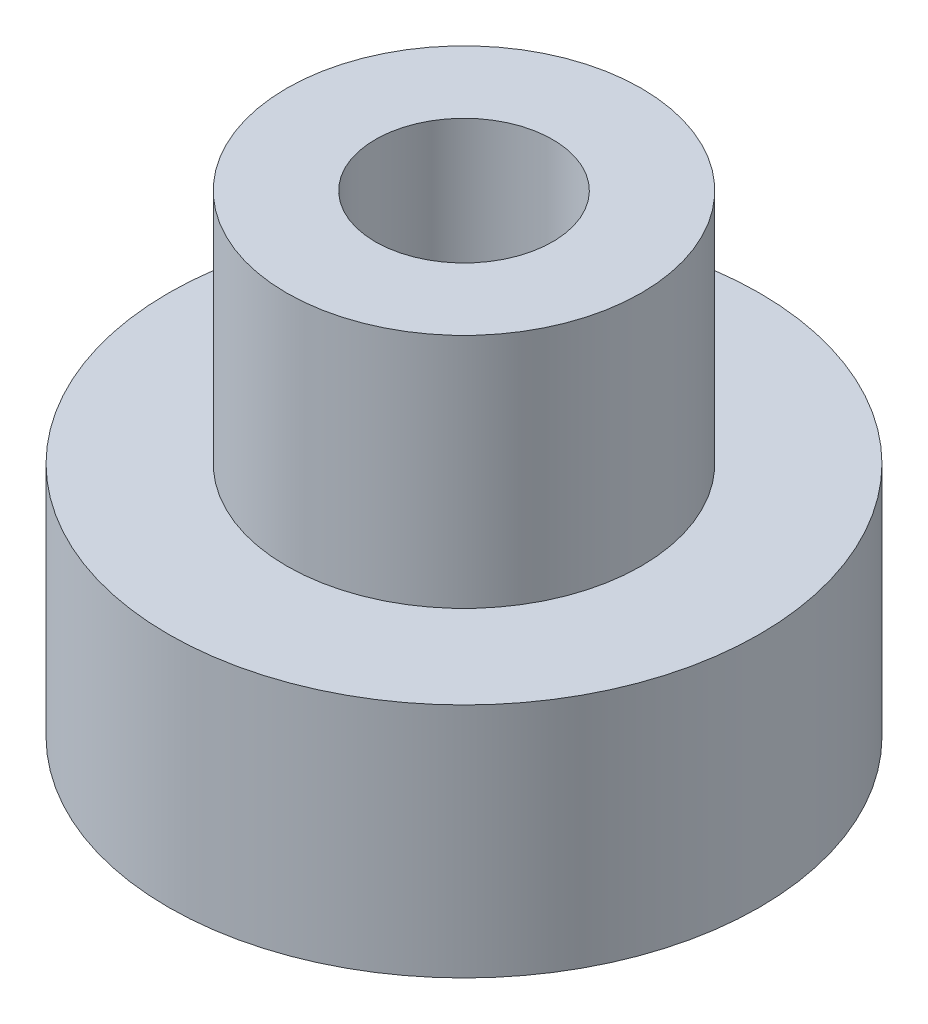
ISO-10303-21;
HEADER;
FILE_DESCRIPTION(('STEP AP214'),'2;1');
FILE_NAME('part.step','',(''),(''),'','','');
FILE_SCHEMA(('AUTOMOTIVE_DESIGN { 1 0 10303 214 1 1 1 1 }'));
ENDSEC;
DATA;
#1=APPLICATION_CONTEXT('core data for automotive mechanical design processes');
#2=APPLICATION_PROTOCOL_DEFINITION('international standard','automotive_design',2000,#1);
#3=PRODUCT_CONTEXT('',#1,'mechanical');
#4=PRODUCT('Part','Part','',(#3));
#5=PRODUCT_RELATED_PRODUCT_CATEGORY('part','',(#4));
#6=PRODUCT_DEFINITION_FORMATION('','',#4);
#7=PRODUCT_DEFINITION_CONTEXT('part definition',#1,'design');
#8=PRODUCT_DEFINITION('design','',#6,#7);
#9=PRODUCT_DEFINITION_SHAPE('','',#8);
#10=(LENGTH_UNIT() NAMED_UNIT(*) SI_UNIT(.MILLI.,.METRE.));
#11=(NAMED_UNIT(*) PLANE_ANGLE_UNIT() SI_UNIT($,.RADIAN.));
#12=(NAMED_UNIT(*) SI_UNIT($,.STERADIAN.) SOLID_ANGLE_UNIT());
#13=UNCERTAINTY_MEASURE_WITH_UNIT(LENGTH_MEASURE(1.E-05),#10,'distance_accuracy_value','');
#14=(GEOMETRIC_REPRESENTATION_CONTEXT(3) GLOBAL_UNCERTAINTY_ASSIGNED_CONTEXT((#13)) GLOBAL_UNIT_ASSIGNED_CONTEXT((#10,
#11,#12)) REPRESENTATION_CONTEXT('',''));
#15=CARTESIAN_POINT('',(0.,0.,0.));
#16=DIRECTION('',(0.,0.,1.));
#17=DIRECTION('',(1.,0.,0.));
#18=AXIS2_PLACEMENT_3D('',#15,#16,#17);
#19=CARTESIAN_POINT('',(0.,8.,0.));
#20=DIRECTION('',(0.,-1.,0.));
#21=DIRECTION('',(0.,0.,-1.));
#22=AXIS2_PLACEMENT_3D('',#19,#20,#21);
#23=CYLINDRICAL_SURFACE('',#22,3.);
#24=CARTESIAN_POINT('',(0.,8.,0.));
#25=DIRECTION('',(0.,1.,0.));
#26=DIRECTION('',(0.,0.,1.));
#27=AXIS2_PLACEMENT_3D('',#24,#25,#26);
#28=CIRCLE('',#27,3.);
#29=CARTESIAN_POINT('',(0.,8.,3.));
#30=VERTEX_POINT('',#29);
#31=EDGE_CURVE('E44',#30,#30,#28,.T.);
#32=ORIENTED_EDGE('',*,*,#31,.F.);
#33=EDGE_LOOP('',(#32));
#34=FACE_BOUND('',#33,.T.);
#35=CARTESIAN_POINT('',(0.,4.,0.));
#36=DIRECTION('',(0.,-1.,0.));
#37=DIRECTION('',(0.,0.,-1.));
#38=AXIS2_PLACEMENT_3D('',#35,#36,#37);
#39=CIRCLE('',#38,3.);
#40=CARTESIAN_POINT('',(0.,4.,-3.));
#41=VERTEX_POINT('',#40);
#42=EDGE_CURVE('E10',#41,#41,#39,.T.);
#43=ORIENTED_EDGE('',*,*,#42,.F.);
#44=EDGE_LOOP('',(#43));
#45=FACE_BOUND('',#44,.T.);
#46=ADVANCED_FACE('F37',(#34,#45),#23,.T.);
#47=CARTESIAN_POINT('',(0.,8.,0.));
#48=DIRECTION('',(0.,1.,0.));
#49=DIRECTION('',(0.,0.,1.));
#50=AXIS2_PLACEMENT_3D('',#47,#48,#49);
#51=PLANE('',#50);
#52=CARTESIAN_POINT('',(0.,8.,0.));
#53=DIRECTION('',(0.,1.,0.));
#54=DIRECTION('',(0.,0.,1.));
#55=AXIS2_PLACEMENT_3D('',#52,#53,#54);
#56=CIRCLE('',#55,1.5);
#57=CARTESIAN_POINT('',(0.,8.,1.5));
#58=VERTEX_POINT('',#57);
#59=EDGE_CURVE('E54',#58,#58,#56,.T.);
#60=ORIENTED_EDGE('',*,*,#59,.F.);
#61=EDGE_LOOP('',(#60));
#62=FACE_BOUND('',#61,.T.);
#63=ORIENTED_EDGE('',*,*,#31,.T.);
#64=EDGE_LOOP('',(#63));
#65=FACE_BOUND('',#64,.T.);
#66=ADVANCED_FACE('F81',(#62,#65),#51,.T.);
#67=CARTESIAN_POINT('',(0.,0.,0.));
#68=DIRECTION('',(0.,1.,0.));
#69=DIRECTION('',(0.,0.,1.));
#70=AXIS2_PLACEMENT_3D('',#67,#68,#69);
#71=PLANE('',#70);
#72=CARTESIAN_POINT('',(0.,0.,0.));
#73=DIRECTION('',(0.,1.,0.));
#74=DIRECTION('',(0.,0.,1.));
#75=AXIS2_PLACEMENT_3D('',#72,#73,#74);
#76=CIRCLE('',#75,1.5);
#77=CARTESIAN_POINT('',(0.,0.,1.5));
#78=VERTEX_POINT('',#77);
#79=EDGE_CURVE('E49',#78,#78,#76,.T.);
#80=ORIENTED_EDGE('',*,*,#79,.T.);
#81=EDGE_LOOP('',(#80));
#82=FACE_BOUND('',#81,.T.);
#83=CARTESIAN_POINT('',(0.,0.,0.));
#84=DIRECTION('',(0.,-1.,0.));
#85=DIRECTION('',(0.,0.,-1.));
#86=AXIS2_PLACEMENT_3D('',#83,#84,#85);
#87=CIRCLE('',#86,5.);
#88=CARTESIAN_POINT('',(0.,0.,-5.));
#89=VERTEX_POINT('',#88);
#90=EDGE_CURVE('E61',#89,#89,#87,.T.);
#91=ORIENTED_EDGE('',*,*,#90,.T.);
#92=EDGE_LOOP('',(#91));
#93=FACE_BOUND('',#92,.T.);
#94=ADVANCED_FACE('F86',(#82,#93),#71,.F.);
#95=CARTESIAN_POINT('',(0.,0.,0.));
#96=DIRECTION('',(0.,1.,0.));
#97=DIRECTION('',(0.,0.,1.));
#98=AXIS2_PLACEMENT_3D('',#95,#96,#97);
#99=CYLINDRICAL_SURFACE('',#98,1.5);
#100=ORIENTED_EDGE('',*,*,#79,.F.);
#101=EDGE_LOOP('',(#100));
#102=FACE_BOUND('',#101,.T.);
#103=ORIENTED_EDGE('',*,*,#59,.T.);
#104=EDGE_LOOP('',(#103));
#105=FACE_BOUND('',#104,.T.);
#106=ADVANCED_FACE('F78',(#102,#105),#99,.F.);
#107=CARTESIAN_POINT('',(0.,4.,0.));
#108=DIRECTION('',(0.,-1.,0.));
#109=DIRECTION('',(0.,0.,-1.));
#110=AXIS2_PLACEMENT_3D('',#107,#108,#109);
#111=CYLINDRICAL_SURFACE('',#110,5.);
#112=CARTESIAN_POINT('',(0.,4.,0.));
#113=DIRECTION('',(0.,-1.,0.));
#114=DIRECTION('',(0.,0.,-1.));
#115=AXIS2_PLACEMENT_3D('',#112,#113,#114);
#116=CIRCLE('',#115,5.);
#117=CARTESIAN_POINT('',(0.,4.,-5.));
#118=VERTEX_POINT('',#117);
#119=EDGE_CURVE('E59',#118,#118,#116,.T.);
#120=ORIENTED_EDGE('',*,*,#119,.T.);
#121=EDGE_LOOP('',(#120));
#122=FACE_BOUND('',#121,.T.);
#123=ORIENTED_EDGE('',*,*,#90,.F.);
#124=EDGE_LOOP('',(#123));
#125=FACE_BOUND('',#124,.T.);
#126=ADVANCED_FACE('F69',(#122,#125),#111,.T.);
#127=CARTESIAN_POINT('',(0.,4.,0.));
#128=DIRECTION('',(0.,-1.,0.));
#129=DIRECTION('',(0.,0.,-1.));
#130=AXIS2_PLACEMENT_3D('',#127,#128,#129);
#131=PLANE('',#130);
#132=ORIENTED_EDGE('',*,*,#42,.T.);
#133=EDGE_LOOP('',(#132));
#134=FACE_BOUND('',#133,.T.);
#135=ORIENTED_EDGE('',*,*,#119,.F.);
#136=EDGE_LOOP('',(#135));
#137=FACE_BOUND('',#136,.T.);
#138=ADVANCED_FACE('F72',(#134,#137),#131,.F.);
#139=CLOSED_SHELL('',(#46,#66,#94,#106,#126,#138));
#140=MANIFOLD_SOLID_BREP('B2',#139);
#141=ADVANCED_BREP_SHAPE_REPRESENTATION('',(#18,#140),#14);
#142=SHAPE_DEFINITION_REPRESENTATION(#9,#141);
ENDSEC;
END-ISO-10303-21;
